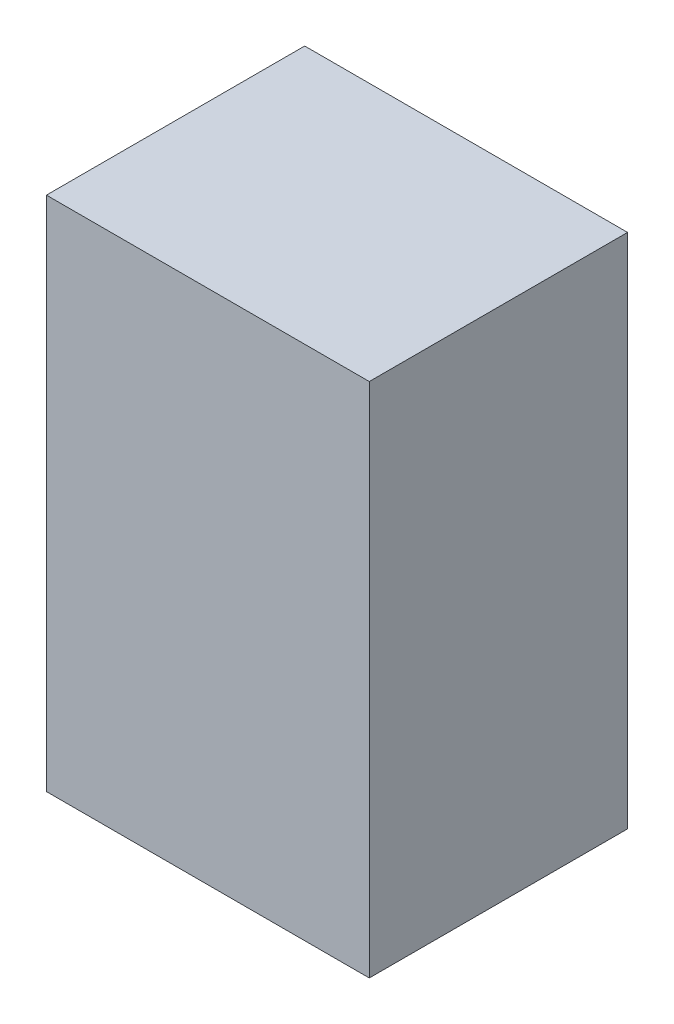
ISO-10303-21;
HEADER;
FILE_DESCRIPTION(('STEP AP214'),'2;1');
FILE_NAME('part.step','',(''),(''),'','','');
FILE_SCHEMA(('AUTOMOTIVE_DESIGN { 1 0 10303 214 1 1 1 1 }'));
ENDSEC;
DATA;
#1=APPLICATION_CONTEXT('core data for automotive mechanical design processes');
#2=APPLICATION_PROTOCOL_DEFINITION('international standard','automotive_design',2000,#1);
#3=PRODUCT_CONTEXT('',#1,'mechanical');
#4=PRODUCT('Part','Part','',(#3));
#5=PRODUCT_RELATED_PRODUCT_CATEGORY('part','',(#4));
#6=PRODUCT_DEFINITION_FORMATION('','',#4);
#7=PRODUCT_DEFINITION_CONTEXT('part definition',#1,'design');
#8=PRODUCT_DEFINITION('design','',#6,#7);
#9=PRODUCT_DEFINITION_SHAPE('','',#8);
#10=(LENGTH_UNIT() NAMED_UNIT(*) SI_UNIT(.MILLI.,.METRE.));
#11=(NAMED_UNIT(*) PLANE_ANGLE_UNIT() SI_UNIT($,.RADIAN.));
#12=(NAMED_UNIT(*) SI_UNIT($,.STERADIAN.) SOLID_ANGLE_UNIT());
#13=UNCERTAINTY_MEASURE_WITH_UNIT(LENGTH_MEASURE(1.E-05),#10,'distance_accuracy_value','');
#14=(GEOMETRIC_REPRESENTATION_CONTEXT(3) GLOBAL_UNCERTAINTY_ASSIGNED_CONTEXT((#13)) GLOBAL_UNIT_ASSIGNED_CONTEXT((#10,
#11,#12)) REPRESENTATION_CONTEXT('',''));
#15=CARTESIAN_POINT('',(0.,0.,0.));
#16=DIRECTION('',(0.,0.,1.));
#17=DIRECTION('',(1.,0.,0.));
#18=AXIS2_PLACEMENT_3D('',#15,#16,#17);
#19=CARTESIAN_POINT('',(50.,40.,20.));
#20=DIRECTION('',(0.,-1.,0.));
#21=DIRECTION('',(0.,0.,-1.));
#22=AXIS2_PLACEMENT_3D('',#19,#20,#21);
#23=PLANE('',#22);
#24=DIRECTION('',(0.,0.,1.));
#25=VECTOR('',#24,1.);
#26=CARTESIAN_POINT('',(0.,40.,20.));
#27=LINE('',#26,#25);
#28=CARTESIAN_POINT('',(0.,40.,-20.));
#29=VERTEX_POINT('',#28);
#30=CARTESIAN_POINT('',(0.,40.,20.));
#31=VERTEX_POINT('',#30);
#32=EDGE_CURVE('E102',#29,#31,#27,.T.);
#33=ORIENTED_EDGE('',*,*,#32,.T.);
#34=DIRECTION('',(-1.,0.,0.));
#35=VECTOR('',#34,1.);
#36=CARTESIAN_POINT('',(50.,40.,20.));
#37=LINE('',#36,#35);
#38=CARTESIAN_POINT('',(50.,40.,20.));
#39=VERTEX_POINT('',#38);
#40=EDGE_CURVE('E11',#39,#31,#37,.T.);
#41=ORIENTED_EDGE('',*,*,#40,.F.);
#42=DIRECTION('',(0.,0.,1.));
#43=VECTOR('',#42,1.);
#44=CARTESIAN_POINT('',(50.,40.,20.));
#45=LINE('',#44,#43);
#46=CARTESIAN_POINT('',(50.,40.,-20.));
#47=VERTEX_POINT('',#46);
#48=EDGE_CURVE('E95',#47,#39,#45,.T.);
#49=ORIENTED_EDGE('',*,*,#48,.F.);
#50=DIRECTION('',(-1.,0.,0.));
#51=VECTOR('',#50,1.);
#52=CARTESIAN_POINT('',(50.,40.,-20.));
#53=LINE('',#52,#51);
#54=EDGE_CURVE('E99',#47,#29,#53,.T.);
#55=ORIENTED_EDGE('',*,*,#54,.T.);
#56=EDGE_LOOP('',(#33,#41,#49,#55));
#57=FACE_BOUND('',#56,.T.);
#58=ADVANCED_FACE('F41',(#57),#23,.F.);
#59=CARTESIAN_POINT('',(50.,-40.,20.));
#60=DIRECTION('',(0.,0.,-1.));
#61=DIRECTION('',(-1.,0.,0.));
#62=AXIS2_PLACEMENT_3D('',#59,#60,#61);
#63=PLANE('',#62);
#64=DIRECTION('',(0.,-1.,0.));
#65=VECTOR('',#64,1.);
#66=CARTESIAN_POINT('',(0.,-40.,20.));
#67=LINE('',#66,#65);
#68=CARTESIAN_POINT('',(0.,-40.,20.));
#69=VERTEX_POINT('',#68);
#70=EDGE_CURVE('E96',#31,#69,#67,.T.);
#71=ORIENTED_EDGE('',*,*,#70,.T.);
#72=DIRECTION('',(-1.,0.,0.));
#73=VECTOR('',#72,1.);
#74=CARTESIAN_POINT('',(50.,-40.,20.));
#75=LINE('',#74,#73);
#76=CARTESIAN_POINT('',(50.,-40.,20.));
#77=VERTEX_POINT('',#76);
#78=EDGE_CURVE('E47',#77,#69,#75,.T.);
#79=ORIENTED_EDGE('',*,*,#78,.F.);
#80=DIRECTION('',(0.,-1.,0.));
#81=VECTOR('',#80,1.);
#82=CARTESIAN_POINT('',(50.,-40.,20.));
#83=LINE('',#82,#81);
#84=EDGE_CURVE('E87',#39,#77,#83,.T.);
#85=ORIENTED_EDGE('',*,*,#84,.F.);
#86=ORIENTED_EDGE('',*,*,#40,.T.);
#87=EDGE_LOOP('',(#71,#79,#85,#86));
#88=FACE_BOUND('',#87,.T.);
#89=ADVANCED_FACE('F92',(#88),#63,.F.);
#90=CARTESIAN_POINT('',(50.,-40.,20.));
#91=DIRECTION('',(0.,1.,0.));
#92=DIRECTION('',(0.,0.,1.));
#93=AXIS2_PLACEMENT_3D('',#90,#91,#92);
#94=PLANE('',#93);
#95=DIRECTION('',(0.,0.,-1.));
#96=VECTOR('',#95,1.);
#97=CARTESIAN_POINT('',(0.,-40.,20.));
#98=LINE('',#97,#96);
#99=CARTESIAN_POINT('',(0.,-40.,-20.));
#100=VERTEX_POINT('',#99);
#101=EDGE_CURVE('E74',#69,#100,#98,.T.);
#102=ORIENTED_EDGE('',*,*,#101,.T.);
#103=DIRECTION('',(-1.,0.,0.));
#104=VECTOR('',#103,1.);
#105=CARTESIAN_POINT('',(50.,-40.,-20.));
#106=LINE('',#105,#104);
#107=CARTESIAN_POINT('',(50.,-40.,-20.));
#108=VERTEX_POINT('',#107);
#109=EDGE_CURVE('E100',#108,#100,#106,.T.);
#110=ORIENTED_EDGE('',*,*,#109,.F.);
#111=DIRECTION('',(0.,0.,-1.));
#112=VECTOR('',#111,1.);
#113=CARTESIAN_POINT('',(50.,-40.,20.));
#114=LINE('',#113,#112);
#115=EDGE_CURVE('E89',#77,#108,#114,.T.);
#116=ORIENTED_EDGE('',*,*,#115,.F.);
#117=ORIENTED_EDGE('',*,*,#78,.T.);
#118=EDGE_LOOP('',(#102,#110,#116,#117));
#119=FACE_BOUND('',#118,.T.);
#120=ADVANCED_FACE('F98',(#119),#94,.F.);
#121=CARTESIAN_POINT('',(50.,-40.,-20.));
#122=DIRECTION('',(0.,0.,1.));
#123=DIRECTION('',(1.,0.,0.));
#124=AXIS2_PLACEMENT_3D('',#121,#122,#123);
#125=PLANE('',#124);
#126=DIRECTION('',(0.,1.,0.));
#127=VECTOR('',#126,1.);
#128=CARTESIAN_POINT('',(0.,-40.,-20.));
#129=LINE('',#128,#127);
#130=EDGE_CURVE('E78',#100,#29,#129,.T.);
#131=ORIENTED_EDGE('',*,*,#130,.T.);
#132=ORIENTED_EDGE('',*,*,#54,.F.);
#133=DIRECTION('',(0.,1.,0.));
#134=VECTOR('',#133,1.);
#135=CARTESIAN_POINT('',(50.,-40.,-20.));
#136=LINE('',#135,#134);
#137=EDGE_CURVE('E60',#108,#47,#136,.T.);
#138=ORIENTED_EDGE('',*,*,#137,.F.);
#139=ORIENTED_EDGE('',*,*,#109,.T.);
#140=EDGE_LOOP('',(#131,#132,#138,#139));
#141=FACE_BOUND('',#140,.T.);
#142=ADVANCED_FACE('F112',(#141),#125,.F.);
#143=CARTESIAN_POINT('',(50.,0.,0.));
#144=DIRECTION('',(1.,0.,0.));
#145=DIRECTION('',(0.,0.,-1.));
#146=AXIS2_PLACEMENT_3D('',#143,#144,#145);
#147=PLANE('',#146);
#148=ORIENTED_EDGE('',*,*,#48,.T.);
#149=ORIENTED_EDGE('',*,*,#84,.T.);
#150=ORIENTED_EDGE('',*,*,#115,.T.);
#151=ORIENTED_EDGE('',*,*,#137,.T.);
#152=EDGE_LOOP('',(#148,#149,#150,#151));
#153=FACE_BOUND('',#152,.T.);
#154=ADVANCED_FACE('F86',(#153),#147,.T.);
#155=CARTESIAN_POINT('',(0.,0.,0.));
#156=DIRECTION('',(1.,0.,0.));
#157=DIRECTION('',(0.,0.,-1.));
#158=AXIS2_PLACEMENT_3D('',#155,#156,#157);
#159=PLANE('',#158);
#160=ORIENTED_EDGE('',*,*,#32,.F.);
#161=ORIENTED_EDGE('',*,*,#130,.F.);
#162=ORIENTED_EDGE('',*,*,#101,.F.);
#163=ORIENTED_EDGE('',*,*,#70,.F.);
#164=EDGE_LOOP('',(#160,#161,#162,#163));
#165=FACE_BOUND('',#164,.T.);
#166=ADVANCED_FACE('F111',(#165),#159,.F.);
#167=CLOSED_SHELL('',(#58,#89,#120,#142,#154,#166));
#168=MANIFOLD_SOLID_BREP('B2',#167);
#169=ADVANCED_BREP_SHAPE_REPRESENTATION('',(#18,#168),#14);
#170=SHAPE_DEFINITION_REPRESENTATION(#9,#169);
ENDSEC;
END-ISO-10303-21;
